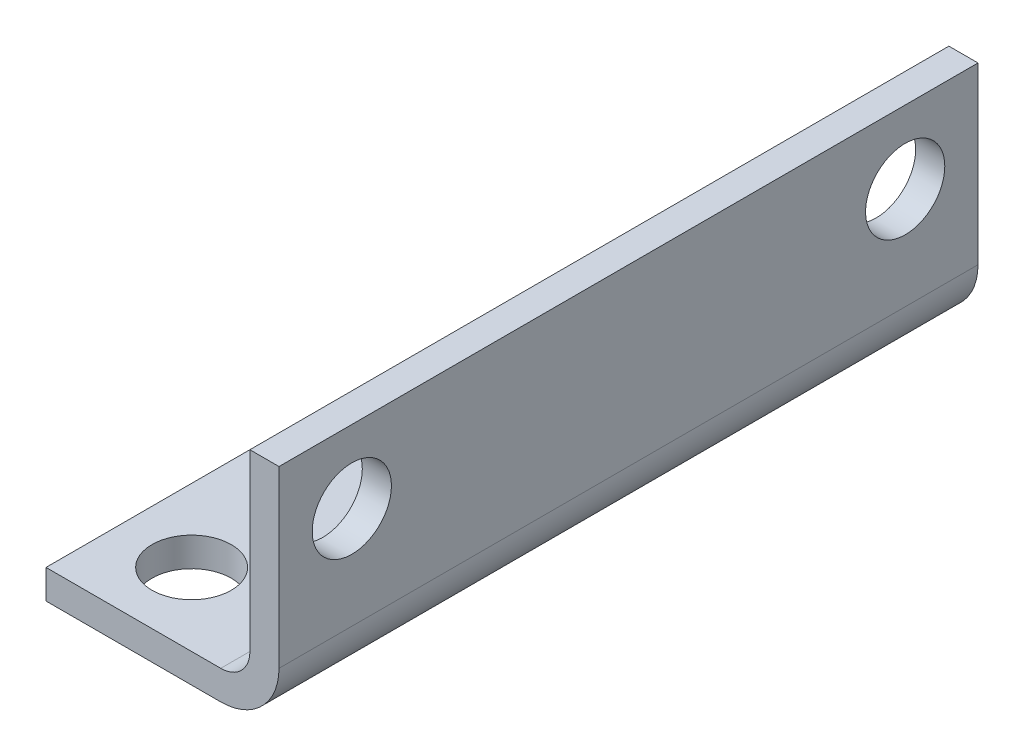
ISO-10303-21;
HEADER;
FILE_DESCRIPTION(('STEP AP214'),'2;1');
FILE_NAME('part.step','',(''),(''),'','','');
FILE_SCHEMA(('AUTOMOTIVE_DESIGN { 1 0 10303 214 1 1 1 1 }'));
ENDSEC;
DATA;
#1=APPLICATION_CONTEXT('core data for automotive mechanical design processes');
#2=APPLICATION_PROTOCOL_DEFINITION('international standard','automotive_design',2000,#1);
#3=PRODUCT_CONTEXT('',#1,'mechanical');
#4=PRODUCT('Part','Part','',(#3));
#5=PRODUCT_RELATED_PRODUCT_CATEGORY('part','',(#4));
#6=PRODUCT_DEFINITION_FORMATION('','',#4);
#7=PRODUCT_DEFINITION_CONTEXT('part definition',#1,'design');
#8=PRODUCT_DEFINITION('design','',#6,#7);
#9=PRODUCT_DEFINITION_SHAPE('','',#8);
#10=(LENGTH_UNIT() NAMED_UNIT(*) SI_UNIT(.MILLI.,.METRE.));
#11=(NAMED_UNIT(*) PLANE_ANGLE_UNIT() SI_UNIT($,.RADIAN.));
#12=(NAMED_UNIT(*) SI_UNIT($,.STERADIAN.) SOLID_ANGLE_UNIT());
#13=UNCERTAINTY_MEASURE_WITH_UNIT(LENGTH_MEASURE(1.E-05),#10,'distance_accuracy_value','');
#14=(GEOMETRIC_REPRESENTATION_CONTEXT(3) GLOBAL_UNCERTAINTY_ASSIGNED_CONTEXT((#13)) GLOBAL_UNIT_ASSIGNED_CONTEXT((#10,
#11,#12)) REPRESENTATION_CONTEXT('',''));
#15=CARTESIAN_POINT('',(0.,0.,0.));
#16=DIRECTION('',(0.,0.,1.));
#17=DIRECTION('',(1.,0.,0.));
#18=AXIS2_PLACEMENT_3D('',#15,#16,#17);
#19=CARTESIAN_POINT('',(22.225,17.4625,7.9375));
#20=DIRECTION('',(1.,0.,0.));
#21=DIRECTION('',(0.,0.,-1.));
#22=AXIS2_PLACEMENT_3D('',#19,#20,#21);
#23=CYLINDRICAL_SURFACE('',#22,4.318);
#24=CARTESIAN_POINT('',(22.225,17.4625,7.9375));
#25=DIRECTION('',(1.,0.,0.));
#26=DIRECTION('',(0.,0.,-1.));
#27=AXIS2_PLACEMENT_3D('',#24,#25,#26);
#28=CIRCLE('',#27,4.318);
#29=CARTESIAN_POINT('',(22.225,17.4625,3.6195));
#30=VERTEX_POINT('',#29);
#31=EDGE_CURVE('E116',#30,#30,#28,.T.);
#32=ORIENTED_EDGE('',*,*,#31,.F.);
#33=EDGE_LOOP('',(#32));
#34=FACE_BOUND('',#33,.T.);
#35=CARTESIAN_POINT('',(25.4,17.4625,7.9375));
#36=DIRECTION('',(1.,0.,0.));
#37=DIRECTION('',(0.,0.,-1.));
#38=AXIS2_PLACEMENT_3D('',#35,#36,#37);
#39=CIRCLE('',#38,4.318);
#40=CARTESIAN_POINT('',(25.4,17.4625,3.6195));
#41=VERTEX_POINT('',#40);
#42=EDGE_CURVE('E20',#41,#41,#39,.F.);
#43=ORIENTED_EDGE('',*,*,#42,.F.);
#44=EDGE_LOOP('',(#43));
#45=FACE_BOUND('',#44,.T.);
#46=ADVANCED_FACE('F16',(#34,#45),#23,.F.);
#47=CARTESIAN_POINT('',(22.225,17.4625,68.2625));
#48=DIRECTION('',(1.,0.,0.));
#49=DIRECTION('',(0.,0.,-1.));
#50=AXIS2_PLACEMENT_3D('',#47,#48,#49);
#51=CYLINDRICAL_SURFACE('',#50,4.318);
#52=CARTESIAN_POINT('',(22.225,17.4625,68.2625));
#53=DIRECTION('',(1.,0.,0.));
#54=DIRECTION('',(0.,0.,-1.));
#55=AXIS2_PLACEMENT_3D('',#52,#53,#54);
#56=CIRCLE('',#55,4.318);
#57=CARTESIAN_POINT('',(22.225,17.4625,63.9445));
#58=VERTEX_POINT('',#57);
#59=EDGE_CURVE('E113',#58,#58,#56,.T.);
#60=ORIENTED_EDGE('',*,*,#59,.F.);
#61=EDGE_LOOP('',(#60));
#62=FACE_BOUND('',#61,.T.);
#63=CARTESIAN_POINT('',(25.4,17.4625,68.2625));
#64=DIRECTION('',(1.,0.,0.));
#65=DIRECTION('',(0.,0.,-1.));
#66=AXIS2_PLACEMENT_3D('',#63,#64,#65);
#67=CIRCLE('',#66,4.318);
#68=CARTESIAN_POINT('',(25.4,17.4625,63.9445));
#69=VERTEX_POINT('',#68);
#70=EDGE_CURVE('E119',#69,#69,#67,.F.);
#71=ORIENTED_EDGE('',*,*,#70,.F.);
#72=EDGE_LOOP('',(#71));
#73=FACE_BOUND('',#72,.T.);
#74=ADVANCED_FACE('F129',(#62,#73),#51,.F.);
#75=CARTESIAN_POINT('',(19.05,6.35,0.));
#76=DIRECTION('',(0.,0.,1.));
#77=DIRECTION('',(1.,0.,0.));
#78=AXIS2_PLACEMENT_3D('',#75,#76,#77);
#79=CYLINDRICAL_SURFACE('',#78,6.35);
#80=CARTESIAN_POINT('',(19.05,6.35,0.));
#81=DIRECTION('',(0.,0.,1.));
#82=DIRECTION('',(1.,0.,0.));
#83=AXIS2_PLACEMENT_3D('',#80,#81,#82);
#84=CIRCLE('',#83,6.35);
#85=CARTESIAN_POINT('',(19.05,0.,0.));
#86=VERTEX_POINT('',#85);
#87=CARTESIAN_POINT('',(25.4,6.35,0.));
#88=VERTEX_POINT('',#87);
#89=EDGE_CURVE('E90',#86,#88,#84,.T.);
#90=ORIENTED_EDGE('',*,*,#89,.T.);
#91=DIRECTION('',(0.,0.,-1.));
#92=VECTOR('',#91,1.);
#93=CARTESIAN_POINT('',(25.4,6.35,0.));
#94=LINE('',#93,#92);
#95=CARTESIAN_POINT('',(25.4,6.35,76.2));
#96=VERTEX_POINT('',#95);
#97=EDGE_CURVE('E83',#96,#88,#94,.T.);
#98=ORIENTED_EDGE('',*,*,#97,.F.);
#99=CARTESIAN_POINT('',(19.05,6.35,76.2));
#100=DIRECTION('',(0.,0.,1.));
#101=DIRECTION('',(1.,0.,0.));
#102=AXIS2_PLACEMENT_3D('',#99,#100,#101);
#103=CIRCLE('',#102,6.35);
#104=CARTESIAN_POINT('',(19.05,0.,76.2));
#105=VERTEX_POINT('',#104);
#106=EDGE_CURVE('E87',#105,#96,#103,.T.);
#107=ORIENTED_EDGE('',*,*,#106,.F.);
#108=DIRECTION('',(0.,0.,-1.));
#109=VECTOR('',#108,1.);
#110=CARTESIAN_POINT('',(19.05,0.,0.));
#111=LINE('',#110,#109);
#112=EDGE_CURVE('E78',#86,#105,#111,.F.);
#113=ORIENTED_EDGE('',*,*,#112,.F.);
#114=EDGE_LOOP('',(#90,#98,#107,#113));
#115=FACE_BOUND('',#114,.T.);
#116=ADVANCED_FACE('F85',(#115),#79,.T.);
#117=CARTESIAN_POINT('',(25.4,25.4,0.));
#118=DIRECTION('',(1.,0.,0.));
#119=DIRECTION('',(0.,0.,-1.));
#120=AXIS2_PLACEMENT_3D('',#117,#118,#119);
#121=PLANE('',#120);
#122=ORIENTED_EDGE('',*,*,#70,.T.);
#123=EDGE_LOOP('',(#122));
#124=FACE_BOUND('',#123,.T.);
#125=ORIENTED_EDGE('',*,*,#42,.T.);
#126=EDGE_LOOP('',(#125));
#127=FACE_BOUND('',#126,.T.);
#128=DIRECTION('',(0.,1.,0.));
#129=VECTOR('',#128,1.);
#130=CARTESIAN_POINT('',(25.4,8.17017413075121,0.));
#131=LINE('',#130,#129);
#132=CARTESIAN_POINT('',(25.4,25.4,0.));
#133=VERTEX_POINT('',#132);
#134=EDGE_CURVE('E287',#88,#133,#131,.T.);
#135=ORIENTED_EDGE('',*,*,#134,.T.);
#136=DIRECTION('',(0.,0.,1.));
#137=VECTOR('',#136,1.);
#138=CARTESIAN_POINT('',(25.4,25.4,0.));
#139=LINE('',#138,#137);
#140=CARTESIAN_POINT('',(25.4,25.4,76.2));
#141=VERTEX_POINT('',#140);
#142=EDGE_CURVE('E98',#141,#133,#139,.F.);
#143=ORIENTED_EDGE('',*,*,#142,.F.);
#144=DIRECTION('',(0.,1.,0.));
#145=VECTOR('',#144,1.);
#146=CARTESIAN_POINT('',(25.4,8.17017413075121,76.2));
#147=LINE('',#146,#145);
#148=EDGE_CURVE('E95',#96,#141,#147,.T.);
#149=ORIENTED_EDGE('',*,*,#148,.F.);
#150=ORIENTED_EDGE('',*,*,#97,.T.);
#151=EDGE_LOOP('',(#135,#143,#149,#150));
#152=FACE_BOUND('',#151,.T.);
#153=ADVANCED_FACE('F96',(#124,#127,#152),#121,.T.);
#154=CARTESIAN_POINT('',(22.225,25.4,0.));
#155=DIRECTION('',(0.,1.,0.));
#156=DIRECTION('',(0.,0.,1.));
#157=AXIS2_PLACEMENT_3D('',#154,#155,#156);
#158=PLANE('',#157);
#159=DIRECTION('',(1.,0.,0.));
#160=VECTOR('',#159,1.);
#161=CARTESIAN_POINT('',(17.2298258692488,25.4,0.));
#162=LINE('',#161,#160);
#163=CARTESIAN_POINT('',(22.225,25.4,0.));
#164=VERTEX_POINT('',#163);
#165=EDGE_CURVE('E288',#133,#164,#162,.F.);
#166=ORIENTED_EDGE('',*,*,#165,.T.);
#167=DIRECTION('',(0.,0.,1.));
#168=VECTOR('',#167,1.);
#169=CARTESIAN_POINT('',(22.225,25.4,0.));
#170=LINE('',#169,#168);
#171=CARTESIAN_POINT('',(22.225,25.4,76.2));
#172=VERTEX_POINT('',#171);
#173=EDGE_CURVE('E118',#172,#164,#170,.F.);
#174=ORIENTED_EDGE('',*,*,#173,.F.);
#175=DIRECTION('',(1.,0.,0.));
#176=VECTOR('',#175,1.);
#177=CARTESIAN_POINT('',(17.2298258692488,25.4,76.2));
#178=LINE('',#177,#176);
#179=EDGE_CURVE('E102',#141,#172,#178,.F.);
#180=ORIENTED_EDGE('',*,*,#179,.F.);
#181=ORIENTED_EDGE('',*,*,#142,.T.);
#182=EDGE_LOOP('',(#166,#174,#180,#181));
#183=FACE_BOUND('',#182,.T.);
#184=ADVANCED_FACE('F170',(#183),#158,.T.);
#185=CARTESIAN_POINT('',(22.225,6.35,0.));
#186=DIRECTION('',(-1.,0.,0.));
#187=DIRECTION('',(0.,0.,1.));
#188=AXIS2_PLACEMENT_3D('',#185,#186,#187);
#189=PLANE('',#188);
#190=ORIENTED_EDGE('',*,*,#59,.T.);
#191=EDGE_LOOP('',(#190));
#192=FACE_BOUND('',#191,.T.);
#193=ORIENTED_EDGE('',*,*,#31,.T.);
#194=EDGE_LOOP('',(#193));
#195=FACE_BOUND('',#194,.T.);
#196=DIRECTION('',(0.,1.,0.));
#197=VECTOR('',#196,1.);
#198=CARTESIAN_POINT('',(22.225,8.17017413075121,0.));
#199=LINE('',#198,#197);
#200=CARTESIAN_POINT('',(22.225,6.35,0.));
#201=VERTEX_POINT('',#200);
#202=EDGE_CURVE('E286',#164,#201,#199,.F.);
#203=ORIENTED_EDGE('',*,*,#202,.T.);
#204=DIRECTION('',(0.,0.,1.));
#205=VECTOR('',#204,1.);
#206=CARTESIAN_POINT('',(22.225,6.35,0.));
#207=LINE('',#206,#205);
#208=CARTESIAN_POINT('',(22.225,6.35,76.2));
#209=VERTEX_POINT('',#208);
#210=EDGE_CURVE('E290',#201,#209,#207,.T.);
#211=ORIENTED_EDGE('',*,*,#210,.T.);
#212=DIRECTION('',(0.,1.,0.));
#213=VECTOR('',#212,1.);
#214=CARTESIAN_POINT('',(22.225,8.17017413075121,76.2));
#215=LINE('',#214,#213);
#216=EDGE_CURVE('E294',#172,#209,#215,.F.);
#217=ORIENTED_EDGE('',*,*,#216,.F.);
#218=ORIENTED_EDGE('',*,*,#173,.T.);
#219=EDGE_LOOP('',(#203,#211,#217,#218));
#220=FACE_BOUND('',#219,.T.);
#221=ADVANCED_FACE('F166',(#192,#195,#220),#189,.T.);
#222=CARTESIAN_POINT('',(19.05,0.,0.));
#223=DIRECTION('',(0.,-1.,0.));
#224=DIRECTION('',(0.,0.,-1.));
#225=AXIS2_PLACEMENT_3D('',#222,#223,#224);
#226=PLANE('',#225);
#227=CARTESIAN_POINT('',(7.9375,0.,68.2625));
#228=DIRECTION('',(0.,-1.,0.));
#229=DIRECTION('',(0.,0.,-1.));
#230=AXIS2_PLACEMENT_3D('',#227,#228,#229);
#231=CIRCLE('',#230,4.318);
#232=CARTESIAN_POINT('',(7.9375,0.,63.9445));
#233=VERTEX_POINT('',#232);
#234=EDGE_CURVE('E274',#233,#233,#231,.F.);
#235=ORIENTED_EDGE('',*,*,#234,.T.);
#236=EDGE_LOOP('',(#235));
#237=FACE_BOUND('',#236,.T.);
#238=CARTESIAN_POINT('',(7.9375,0.,7.9375));
#239=DIRECTION('',(0.,-1.,0.));
#240=DIRECTION('',(0.,0.,-1.));
#241=AXIS2_PLACEMENT_3D('',#238,#239,#240);
#242=CIRCLE('',#241,4.318);
#243=CARTESIAN_POINT('',(7.9375,0.,3.6195));
#244=VERTEX_POINT('',#243);
#245=EDGE_CURVE('E272',#244,#244,#242,.F.);
#246=ORIENTED_EDGE('',*,*,#245,.T.);
#247=EDGE_LOOP('',(#246));
#248=FACE_BOUND('',#247,.T.);
#249=DIRECTION('',(1.,0.,0.));
#250=VECTOR('',#249,1.);
#251=CARTESIAN_POINT('',(17.2298258692488,0.,0.));
#252=LINE('',#251,#250);
#253=CARTESIAN_POINT('',(0.,0.,0.));
#254=VERTEX_POINT('',#253);
#255=EDGE_CURVE('E285',#254,#86,#252,.T.);
#256=ORIENTED_EDGE('',*,*,#255,.T.);
#257=ORIENTED_EDGE('',*,*,#112,.T.);
#258=DIRECTION('',(1.,0.,0.));
#259=VECTOR('',#258,1.);
#260=CARTESIAN_POINT('',(17.2298258692488,0.,76.2));
#261=LINE('',#260,#259);
#262=CARTESIAN_POINT('',(0.,0.,76.2));
#263=VERTEX_POINT('',#262);
#264=EDGE_CURVE('E106',#263,#105,#261,.T.);
#265=ORIENTED_EDGE('',*,*,#264,.F.);
#266=DIRECTION('',(0.,0.,1.));
#267=VECTOR('',#266,1.);
#268=CARTESIAN_POINT('',(0.,0.,0.));
#269=LINE('',#268,#267);
#270=EDGE_CURVE('E275',#254,#263,#269,.T.);
#271=ORIENTED_EDGE('',*,*,#270,.F.);
#272=EDGE_LOOP('',(#256,#257,#265,#271));
#273=FACE_BOUND('',#272,.T.);
#274=ADVANCED_FACE('F163',(#237,#248,#273),#226,.T.);
#275=CARTESIAN_POINT('',(17.2298258692488,8.17017413075121,76.2));
#276=DIRECTION('',(0.,0.,1.));
#277=DIRECTION('',(1.,0.,0.));
#278=AXIS2_PLACEMENT_3D('',#275,#276,#277);
#279=PLANE('',#278);
#280=CARTESIAN_POINT('',(19.05,6.35,76.2));
#281=DIRECTION('',(0.,0.,1.));
#282=DIRECTION('',(1.,0.,0.));
#283=AXIS2_PLACEMENT_3D('',#280,#281,#282);
#284=CIRCLE('',#283,3.175);
#285=CARTESIAN_POINT('',(19.05,3.175,76.2));
#286=VERTEX_POINT('',#285);
#287=EDGE_CURVE('E111',#209,#286,#284,.F.);
#288=ORIENTED_EDGE('',*,*,#287,.T.);
#289=DIRECTION('',(1.,0.,0.));
#290=VECTOR('',#289,1.);
#291=CARTESIAN_POINT('',(0.,3.175,76.2));
#292=LINE('',#291,#290);
#293=CARTESIAN_POINT('',(0.,3.175,76.2));
#294=VERTEX_POINT('',#293);
#295=EDGE_CURVE('E278',#294,#286,#292,.T.);
#296=ORIENTED_EDGE('',*,*,#295,.F.);
#297=DIRECTION('',(0.,1.,0.));
#298=VECTOR('',#297,1.);
#299=CARTESIAN_POINT('',(0.,0.,76.2));
#300=LINE('',#299,#298);
#301=EDGE_CURVE('E329',#263,#294,#300,.T.);
#302=ORIENTED_EDGE('',*,*,#301,.F.);
#303=ORIENTED_EDGE('',*,*,#264,.T.);
#304=ORIENTED_EDGE('',*,*,#106,.T.);
#305=ORIENTED_EDGE('',*,*,#148,.T.);
#306=ORIENTED_EDGE('',*,*,#179,.T.);
#307=ORIENTED_EDGE('',*,*,#216,.T.);
#308=EDGE_LOOP('',(#288,#296,#302,#303,#304,#305,#306,#307));
#309=FACE_BOUND('',#308,.T.);
#310=ADVANCED_FACE('F104',(#309),#279,.T.);
#311=CARTESIAN_POINT('',(19.05,6.35,0.));
#312=DIRECTION('',(0.,0.,1.));
#313=DIRECTION('',(1.,0.,0.));
#314=AXIS2_PLACEMENT_3D('',#311,#312,#313);
#315=CYLINDRICAL_SURFACE('',#314,3.175);
#316=ORIENTED_EDGE('',*,*,#210,.F.);
#317=CARTESIAN_POINT('',(19.05,6.35,0.));
#318=DIRECTION('',(0.,0.,1.));
#319=DIRECTION('',(1.,0.,0.));
#320=AXIS2_PLACEMENT_3D('',#317,#318,#319);
#321=CIRCLE('',#320,3.175);
#322=CARTESIAN_POINT('',(19.05,3.175,0.));
#323=VERTEX_POINT('',#322);
#324=EDGE_CURVE('E284',#201,#323,#321,.F.);
#325=ORIENTED_EDGE('',*,*,#324,.T.);
#326=DIRECTION('',(0.,0.,1.));
#327=VECTOR('',#326,1.);
#328=CARTESIAN_POINT('',(19.05,3.175,0.));
#329=LINE('',#328,#327);
#330=EDGE_CURVE('E321',#286,#323,#329,.F.);
#331=ORIENTED_EDGE('',*,*,#330,.F.);
#332=ORIENTED_EDGE('',*,*,#287,.F.);
#333=EDGE_LOOP('',(#316,#325,#331,#332));
#334=FACE_BOUND('',#333,.T.);
#335=ADVANCED_FACE('F157',(#334),#315,.F.);
#336=CARTESIAN_POINT('',(17.2298258692488,8.17017413075121,0.));
#337=DIRECTION('',(0.,0.,1.));
#338=DIRECTION('',(1.,0.,0.));
#339=AXIS2_PLACEMENT_3D('',#336,#337,#338);
#340=PLANE('',#339);
#341=DIRECTION('',(0.,1.,0.));
#342=VECTOR('',#341,1.);
#343=CARTESIAN_POINT('',(0.,0.,0.));
#344=LINE('',#343,#342);
#345=CARTESIAN_POINT('',(0.,3.175,0.));
#346=VERTEX_POINT('',#345);
#347=EDGE_CURVE('E35',#346,#254,#344,.F.);
#348=ORIENTED_EDGE('',*,*,#347,.F.);
#349=DIRECTION('',(1.,0.,0.));
#350=VECTOR('',#349,1.);
#351=CARTESIAN_POINT('',(0.,3.175,0.));
#352=LINE('',#351,#350);
#353=EDGE_CURVE('E316',#323,#346,#352,.F.);
#354=ORIENTED_EDGE('',*,*,#353,.F.);
#355=ORIENTED_EDGE('',*,*,#324,.F.);
#356=ORIENTED_EDGE('',*,*,#202,.F.);
#357=ORIENTED_EDGE('',*,*,#165,.F.);
#358=ORIENTED_EDGE('',*,*,#134,.F.);
#359=ORIENTED_EDGE('',*,*,#89,.F.);
#360=ORIENTED_EDGE('',*,*,#255,.F.);
#361=EDGE_LOOP('',(#348,#354,#355,#356,#357,#358,#359,#360));
#362=FACE_BOUND('',#361,.T.);
#363=ADVANCED_FACE('F153',(#362),#340,.F.);
#364=CARTESIAN_POINT('',(0.,0.,0.));
#365=DIRECTION('',(-1.,0.,0.));
#366=DIRECTION('',(0.,0.,1.));
#367=AXIS2_PLACEMENT_3D('',#364,#365,#366);
#368=PLANE('',#367);
#369=ORIENTED_EDGE('',*,*,#347,.T.);
#370=ORIENTED_EDGE('',*,*,#270,.T.);
#371=ORIENTED_EDGE('',*,*,#301,.T.);
#372=DIRECTION('',(0.,0.,1.));
#373=VECTOR('',#372,1.);
#374=CARTESIAN_POINT('',(0.,3.175,0.));
#375=LINE('',#374,#373);
#376=EDGE_CURVE('E314',#346,#294,#375,.T.);
#377=ORIENTED_EDGE('',*,*,#376,.F.);
#378=EDGE_LOOP('',(#369,#370,#371,#377));
#379=FACE_BOUND('',#378,.T.);
#380=ADVANCED_FACE('F150',(#379),#368,.T.);
#381=CARTESIAN_POINT('',(7.9375,3.175,7.9375));
#382=DIRECTION('',(0.,-1.,0.));
#383=DIRECTION('',(0.,0.,-1.));
#384=AXIS2_PLACEMENT_3D('',#381,#382,#383);
#385=CYLINDRICAL_SURFACE('',#384,4.318);
#386=CARTESIAN_POINT('',(7.9375,3.175,7.9375));
#387=DIRECTION('',(0.,-1.,0.));
#388=DIRECTION('',(0.,0.,-1.));
#389=AXIS2_PLACEMENT_3D('',#386,#387,#388);
#390=CIRCLE('',#389,4.318);
#391=CARTESIAN_POINT('',(7.9375,3.175,3.6195));
#392=VERTEX_POINT('',#391);
#393=EDGE_CURVE('E26',#392,#392,#390,.T.);
#394=ORIENTED_EDGE('',*,*,#393,.F.);
#395=EDGE_LOOP('',(#394));
#396=FACE_BOUND('',#395,.T.);
#397=ORIENTED_EDGE('',*,*,#245,.F.);
#398=EDGE_LOOP('',(#397));
#399=FACE_BOUND('',#398,.T.);
#400=ADVANCED_FACE('F146',(#396,#399),#385,.F.);
#401=CARTESIAN_POINT('',(7.9375,3.175,68.2625));
#402=DIRECTION('',(0.,-1.,0.));
#403=DIRECTION('',(0.,0.,-1.));
#404=AXIS2_PLACEMENT_3D('',#401,#402,#403);
#405=CYLINDRICAL_SURFACE('',#404,4.318);
#406=CARTESIAN_POINT('',(7.9375,3.175,68.2625));
#407=DIRECTION('',(0.,-1.,0.));
#408=DIRECTION('',(0.,0.,-1.));
#409=AXIS2_PLACEMENT_3D('',#406,#407,#408);
#410=CIRCLE('',#409,4.318);
#411=CARTESIAN_POINT('',(7.9375,3.175,63.9445));
#412=VERTEX_POINT('',#411);
#413=EDGE_CURVE('E11',#412,#412,#410,.T.);
#414=ORIENTED_EDGE('',*,*,#413,.F.);
#415=EDGE_LOOP('',(#414));
#416=FACE_BOUND('',#415,.T.);
#417=ORIENTED_EDGE('',*,*,#234,.F.);
#418=EDGE_LOOP('',(#417));
#419=FACE_BOUND('',#418,.T.);
#420=ADVANCED_FACE('F18',(#416,#419),#405,.F.);
#421=CARTESIAN_POINT('',(0.,3.175,0.));
#422=DIRECTION('',(0.,1.,0.));
#423=DIRECTION('',(0.,0.,1.));
#424=AXIS2_PLACEMENT_3D('',#421,#422,#423);
#425=PLANE('',#424);
#426=ORIENTED_EDGE('',*,*,#413,.T.);
#427=EDGE_LOOP('',(#426));
#428=FACE_BOUND('',#427,.T.);
#429=ORIENTED_EDGE('',*,*,#393,.T.);
#430=EDGE_LOOP('',(#429));
#431=FACE_BOUND('',#430,.T.);
#432=ORIENTED_EDGE('',*,*,#353,.T.);
#433=ORIENTED_EDGE('',*,*,#376,.T.);
#434=ORIENTED_EDGE('',*,*,#295,.T.);
#435=ORIENTED_EDGE('',*,*,#330,.T.);
#436=EDGE_LOOP('',(#432,#433,#434,#435));
#437=FACE_BOUND('',#436,.T.);
#438=ADVANCED_FACE('F140',(#428,#431,#437),#425,.T.);
#439=CLOSED_SHELL('',(#46,#74,#116,#153,#184,#221,#274,#310,#335,#363,#380,#400,#420,#438));
#440=MANIFOLD_SOLID_BREP('B1',#439);
#441=ADVANCED_BREP_SHAPE_REPRESENTATION('',(#18,#440),#14);
#442=SHAPE_DEFINITION_REPRESENTATION(#9,#441);
ENDSEC;
END-ISO-10303-21;
